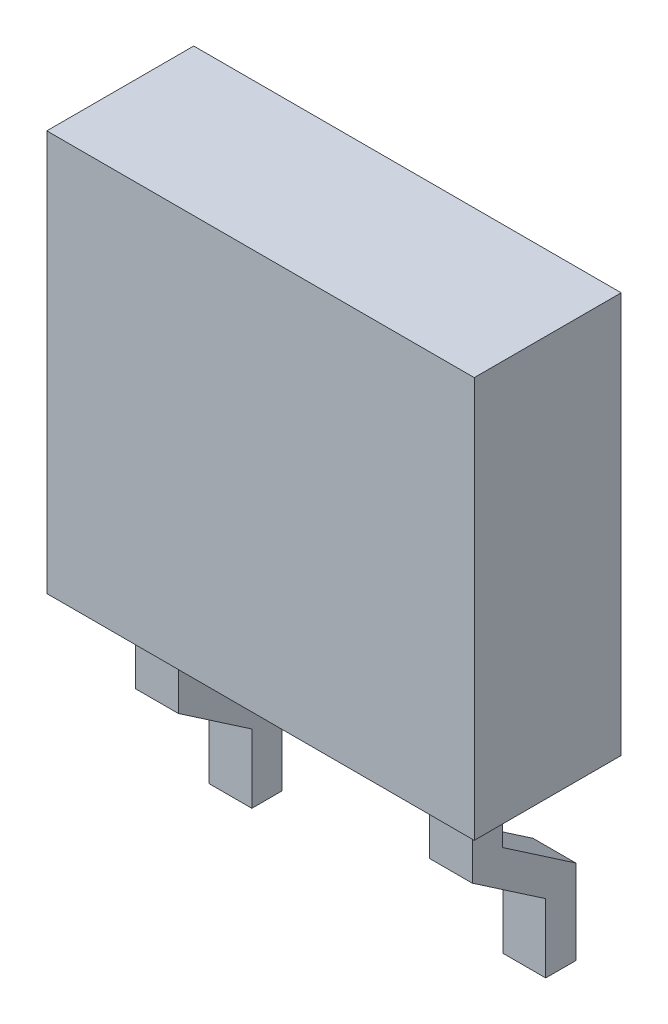
ISO-10303-21;
HEADER;
FILE_DESCRIPTION(('STEP AP214'),'2;1');
FILE_NAME('part.step','',(''),(''),'','','');
FILE_SCHEMA(('AUTOMOTIVE_DESIGN { 1 0 10303 214 1 1 1 1 }'));
ENDSEC;
DATA;
#1=APPLICATION_CONTEXT('core data for automotive mechanical design processes');
#2=APPLICATION_PROTOCOL_DEFINITION('international standard','automotive_design',2000,#1);
#3=PRODUCT_CONTEXT('',#1,'mechanical');
#4=PRODUCT('Part','Part','',(#3));
#5=PRODUCT_RELATED_PRODUCT_CATEGORY('part','',(#4));
#6=PRODUCT_DEFINITION_FORMATION('','',#4);
#7=PRODUCT_DEFINITION_CONTEXT('part definition',#1,'design');
#8=PRODUCT_DEFINITION('design','',#6,#7);
#9=PRODUCT_DEFINITION_SHAPE('','',#8);
#10=(LENGTH_UNIT() NAMED_UNIT(*) SI_UNIT(.MILLI.,.METRE.));
#11=(NAMED_UNIT(*) PLANE_ANGLE_UNIT() SI_UNIT($,.RADIAN.));
#12=(NAMED_UNIT(*) SI_UNIT($,.STERADIAN.) SOLID_ANGLE_UNIT());
#13=UNCERTAINTY_MEASURE_WITH_UNIT(LENGTH_MEASURE(1.E-05),#10,'distance_accuracy_value','');
#14=(GEOMETRIC_REPRESENTATION_CONTEXT(3) GLOBAL_UNCERTAINTY_ASSIGNED_CONTEXT((#13)) GLOBAL_UNIT_ASSIGNED_CONTEXT((#10,
#11,#12)) REPRESENTATION_CONTEXT('',''));
#15=CARTESIAN_POINT('',(0.,0.,0.));
#16=DIRECTION('',(0.,0.,1.));
#17=DIRECTION('',(1.,0.,0.));
#18=AXIS2_PLACEMENT_3D('',#15,#16,#17);
#19=CARTESIAN_POINT('',(0.,6.,0.));
#20=DIRECTION('',(0.,0.,-1.));
#21=DIRECTION('',(-1.,0.,0.));
#22=AXIS2_PLACEMENT_3D('',#19,#20,#21);
#23=PLANE('',#22);
#24=DIRECTION('',(-1.,0.,0.));
#25=VECTOR('',#24,1.);
#26=CARTESIAN_POINT('',(0.,-1.73351997941968,0.));
#27=LINE('',#26,#25);
#28=CARTESIAN_POINT('',(1.32,-1.73351997941969,0.));
#29=VERTEX_POINT('',#28);
#30=CARTESIAN_POINT('',(0.679999999999997,-1.73351997941969,0.));
#31=VERTEX_POINT('',#30);
#32=EDGE_CURVE('E38',#29,#31,#27,.T.);
#33=ORIENTED_EDGE('',*,*,#32,.F.);
#34=DIRECTION('',(0.,1.,0.));
#35=VECTOR('',#34,1.);
#36=CARTESIAN_POINT('',(1.32,0.,0.));
#37=LINE('',#36,#35);
#38=CARTESIAN_POINT('',(1.31999999999999,-2.99999999999999,0.));
#39=VERTEX_POINT('',#38);
#40=EDGE_CURVE('E230',#39,#29,#37,.T.);
#41=ORIENTED_EDGE('',*,*,#40,.F.);
#42=DIRECTION('',(1.,0.,0.));
#43=VECTOR('',#42,1.);
#44=CARTESIAN_POINT('',(1.31999999999999,-2.99999999999999,0.));
#45=LINE('',#44,#43);
#46=CARTESIAN_POINT('',(0.679999999999993,-3.,0.));
#47=VERTEX_POINT('',#46);
#48=EDGE_CURVE('E227',#47,#39,#45,.T.);
#49=ORIENTED_EDGE('',*,*,#48,.F.);
#50=DIRECTION('',(0.,-1.,0.));
#51=VECTOR('',#50,1.);
#52=CARTESIAN_POINT('',(0.679999999999997,0.,0.));
#53=LINE('',#52,#51);
#54=EDGE_CURVE('E223',#31,#47,#53,.T.);
#55=ORIENTED_EDGE('',*,*,#54,.F.);
#56=EDGE_LOOP('',(#33,#41,#49,#55));
#57=FACE_BOUND('',#56,.T.);
#58=ADVANCED_FACE('F34',(#57),#23,.T.);
#59=CARTESIAN_POINT('',(5.72,-1.73351997941969,0.));
#60=VERTEX_POINT('',#59);
#61=CARTESIAN_POINT('',(5.08,-1.73351997941968,0.));
#62=VERTEX_POINT('',#61);
#63=EDGE_CURVE('E11',#60,#62,#27,.T.);
#64=ORIENTED_EDGE('',*,*,#63,.F.);
#65=DIRECTION('',(0.,1.,0.));
#66=VECTOR('',#65,1.);
#67=CARTESIAN_POINT('',(5.72,0.,0.));
#68=LINE('',#67,#66);
#69=CARTESIAN_POINT('',(5.72,-3.,0.));
#70=VERTEX_POINT('',#69);
#71=EDGE_CURVE('E243',#70,#60,#68,.T.);
#72=ORIENTED_EDGE('',*,*,#71,.F.);
#73=DIRECTION('',(1.,0.,0.));
#74=VECTOR('',#73,1.);
#75=CARTESIAN_POINT('',(5.08,-3.,0.));
#76=LINE('',#75,#74);
#77=CARTESIAN_POINT('',(5.08,-3.,0.));
#78=VERTEX_POINT('',#77);
#79=EDGE_CURVE('E240',#78,#70,#76,.T.);
#80=ORIENTED_EDGE('',*,*,#79,.F.);
#81=DIRECTION('',(0.,-1.,0.));
#82=VECTOR('',#81,1.);
#83=CARTESIAN_POINT('',(5.08,0.,0.));
#84=LINE('',#83,#82);
#85=EDGE_CURVE('E238',#62,#78,#84,.T.);
#86=ORIENTED_EDGE('',*,*,#85,.F.);
#87=EDGE_LOOP('',(#64,#72,#80,#86));
#88=FACE_BOUND('',#87,.T.);
#89=ADVANCED_FACE('F342',(#88),#23,.T.);
#90=CARTESIAN_POINT('',(0.,0.,2.2));
#91=DIRECTION('',(1.,0.,0.));
#92=DIRECTION('',(0.,1.,0.));
#93=AXIS2_PLACEMENT_3D('',#90,#91,#92);
#94=PLANE('',#93);
#95=DIRECTION('',(0.,-1.,0.));
#96=VECTOR('',#95,1.);
#97=CARTESIAN_POINT('',(0.,0.,0.));
#98=LINE('',#97,#96);
#99=CARTESIAN_POINT('',(0.,6.,0.));
#100=VERTEX_POINT('',#99);
#101=CARTESIAN_POINT('',(0.,0.,0.));
#102=VERTEX_POINT('',#101);
#103=EDGE_CURVE('E228',#100,#102,#98,.T.);
#104=ORIENTED_EDGE('',*,*,#103,.T.);
#105=DIRECTION('',(0.,0.,-1.));
#106=VECTOR('',#105,1.);
#107=CARTESIAN_POINT('',(0.,0.,2.2));
#108=LINE('',#107,#106);
#109=CARTESIAN_POINT('',(0.,0.,2.2));
#110=VERTEX_POINT('',#109);
#111=EDGE_CURVE('E197',#110,#102,#108,.T.);
#112=ORIENTED_EDGE('',*,*,#111,.F.);
#113=DIRECTION('',(0.,-1.,0.));
#114=VECTOR('',#113,1.);
#115=CARTESIAN_POINT('',(0.,0.,2.2));
#116=LINE('',#115,#114);
#117=CARTESIAN_POINT('',(0.,6.00000000000001,2.2));
#118=VERTEX_POINT('',#117);
#119=EDGE_CURVE('E253',#118,#110,#116,.T.);
#120=ORIENTED_EDGE('',*,*,#119,.F.);
#121=DIRECTION('',(0.,0.,-1.));
#122=VECTOR('',#121,1.);
#123=CARTESIAN_POINT('',(0.,6.00000000000001,2.2));
#124=LINE('',#123,#122);
#125=EDGE_CURVE('E259',#118,#100,#124,.T.);
#126=ORIENTED_EDGE('',*,*,#125,.T.);
#127=EDGE_LOOP('',(#104,#112,#120,#126));
#128=FACE_BOUND('',#127,.T.);
#129=ADVANCED_FACE('F36',(#128),#94,.F.);
#130=CARTESIAN_POINT('',(0.679999999999997,0.,2.2));
#131=DIRECTION('',(1.,0.,0.));
#132=DIRECTION('',(0.,1.,0.));
#133=AXIS2_PLACEMENT_3D('',#130,#131,#132);
#134=PLANE('',#133);
#135=DIRECTION('',(0.,0.,-1.));
#136=VECTOR('',#135,1.);
#137=CARTESIAN_POINT('',(0.679999999999997,0.,2.2));
#138=LINE('',#137,#136);
#139=CARTESIAN_POINT('',(0.679999999999997,0.,1.55));
#140=VERTEX_POINT('',#139);
#141=CARTESIAN_POINT('',(0.680000000000003,0.,1.1));
#142=VERTEX_POINT('',#141);
#143=EDGE_CURVE('E175',#140,#142,#138,.T.);
#144=ORIENTED_EDGE('',*,*,#143,.T.);
#145=DIRECTION('',(0.,1.,0.));
#146=VECTOR('',#145,1.);
#147=CARTESIAN_POINT('',(0.680000000000003,0.,1.1));
#148=LINE('',#147,#146);
#149=CARTESIAN_POINT('',(0.679999999999993,-0.98267509698886,1.1));
#150=VERTEX_POINT('',#149);
#151=EDGE_CURVE('E184',#150,#142,#148,.T.);
#152=ORIENTED_EDGE('',*,*,#151,.F.);
#153=DIRECTION('',(0.,0.563769806185427,0.825931961867105));
#154=VECTOR('',#153,1.);
#155=CARTESIAN_POINT('',(0.679999999999993,-0.98267509698886,1.1));
#156=LINE('',#155,#154);
#157=EDGE_CURVE('E181',#31,#150,#156,.T.);
#158=ORIENTED_EDGE('',*,*,#157,.F.);
#159=ORIENTED_EDGE('',*,*,#54,.T.);
#160=DIRECTION('',(0.,0.,-1.));
#161=VECTOR('',#160,1.);
#162=CARTESIAN_POINT('',(0.679999999999993,-2.99999999999999,2.2));
#163=LINE('',#162,#161);
#164=CARTESIAN_POINT('',(0.679999999999993,-3.,0.450000000000006));
#165=VERTEX_POINT('',#164);
#166=EDGE_CURVE('E198',#165,#47,#163,.T.);
#167=ORIENTED_EDGE('',*,*,#166,.F.);
#168=DIRECTION('',(0.,-1.,0.));
#169=VECTOR('',#168,1.);
#170=CARTESIAN_POINT('',(0.679999999999993,-1.97119523147409,0.450000000000001));
#171=LINE('',#170,#169);
#172=CARTESIAN_POINT('',(0.679999999999993,-1.97119523147409,0.450000000000001));
#173=VERTEX_POINT('',#172);
#174=EDGE_CURVE('E288',#173,#165,#171,.T.);
#175=ORIENTED_EDGE('',*,*,#174,.F.);
#176=DIRECTION('',(0.,-0.563769806185427,-0.825931961867105));
#177=VECTOR('',#176,1.);
#178=CARTESIAN_POINT('',(0.680000000000007,-1.22035034904328,1.55));
#179=LINE('',#178,#177);
#180=CARTESIAN_POINT('',(0.680000000000007,-1.22035034904328,1.55));
#181=VERTEX_POINT('',#180);
#182=EDGE_CURVE('E290',#181,#173,#179,.T.);
#183=ORIENTED_EDGE('',*,*,#182,.F.);
#184=DIRECTION('',(0.,-1.,0.));
#185=VECTOR('',#184,1.);
#186=CARTESIAN_POINT('',(0.679999999999997,0.,1.55));
#187=LINE('',#186,#185);
#188=EDGE_CURVE('E196',#140,#181,#187,.T.);
#189=ORIENTED_EDGE('',*,*,#188,.F.);
#190=EDGE_LOOP('',(#144,#152,#158,#159,#167,#175,#183,#189));
#191=FACE_BOUND('',#190,.T.);
#192=ADVANCED_FACE('F193',(#191),#134,.F.);
#193=CARTESIAN_POINT('',(1.31999999999999,-2.99999999999999,2.2));
#194=DIRECTION('',(0.,1.,0.));
#195=DIRECTION('',(0.,0.,1.));
#196=AXIS2_PLACEMENT_3D('',#193,#194,#195);
#197=PLANE('',#196);
#198=DIRECTION('',(0.,0.,-1.));
#199=VECTOR('',#198,1.);
#200=CARTESIAN_POINT('',(1.31999999999999,-2.99999999999999,2.2));
#201=LINE('',#200,#199);
#202=CARTESIAN_POINT('',(1.32,-3.,0.450000000000001));
#203=VERTEX_POINT('',#202);
#204=EDGE_CURVE('E204',#203,#39,#201,.T.);
#205=ORIENTED_EDGE('',*,*,#204,.F.);
#206=DIRECTION('',(-1.,0.,0.));
#207=VECTOR('',#206,1.);
#208=CARTESIAN_POINT('',(1.32,-3.,0.450000000000001));
#209=LINE('',#208,#207);
#210=EDGE_CURVE('E233',#203,#165,#209,.T.);
#211=ORIENTED_EDGE('',*,*,#210,.T.);
#212=ORIENTED_EDGE('',*,*,#166,.T.);
#213=ORIENTED_EDGE('',*,*,#48,.T.);
#214=EDGE_LOOP('',(#205,#211,#212,#213));
#215=FACE_BOUND('',#214,.T.);
#216=ADVANCED_FACE('F286',(#215),#197,.F.);
#217=CARTESIAN_POINT('',(1.32000000000001,0.,2.2));
#218=DIRECTION('',(-1.,0.,0.));
#219=DIRECTION('',(0.,-1.,0.));
#220=AXIS2_PLACEMENT_3D('',#217,#218,#219);
#221=PLANE('',#220);
#222=DIRECTION('',(0.,0.563769806185427,0.825931961867105));
#223=VECTOR('',#222,1.);
#224=CARTESIAN_POINT('',(1.31999999999999,-0.158146135057723,2.30794837834937));
#225=LINE('',#224,#223);
#226=CARTESIAN_POINT('',(1.31999999999999,-0.982675096988857,1.09999999999999));
#227=VERTEX_POINT('',#226);
#228=EDGE_CURVE('E217',#29,#227,#225,.T.);
#229=ORIENTED_EDGE('',*,*,#228,.T.);
#230=DIRECTION('',(0.,1.,0.));
#231=VECTOR('',#230,1.);
#232=CARTESIAN_POINT('',(1.31999999999999,0.,1.1));
#233=LINE('',#232,#231);
#234=CARTESIAN_POINT('',(1.31999999999999,0.,1.1));
#235=VERTEX_POINT('',#234);
#236=EDGE_CURVE('E360',#227,#235,#233,.T.);
#237=ORIENTED_EDGE('',*,*,#236,.T.);
#238=DIRECTION('',(0.,0.,-1.));
#239=VECTOR('',#238,1.);
#240=CARTESIAN_POINT('',(1.32000000000001,0.,2.2));
#241=LINE('',#240,#239);
#242=CARTESIAN_POINT('',(1.32000000000001,0.,1.55));
#243=VERTEX_POINT('',#242);
#244=EDGE_CURVE('E177',#243,#235,#241,.T.);
#245=ORIENTED_EDGE('',*,*,#244,.F.);
#246=DIRECTION('',(0.,-1.,0.));
#247=VECTOR('',#246,1.);
#248=CARTESIAN_POINT('',(1.32000000000001,0.,1.55));
#249=LINE('',#248,#247);
#250=CARTESIAN_POINT('',(1.32,-1.22035034904327,1.55));
#251=VERTEX_POINT('',#250);
#252=EDGE_CURVE('E311',#243,#251,#249,.T.);
#253=ORIENTED_EDGE('',*,*,#252,.T.);
#254=DIRECTION('',(0.,-0.563769806185427,-0.825931961867105));
#255=VECTOR('',#254,1.);
#256=CARTESIAN_POINT('',(1.32,-0.529815517897929,2.56164479113281));
#257=LINE('',#256,#255);
#258=CARTESIAN_POINT('',(1.32,-1.9711952314741,0.449999999999999));
#259=VERTEX_POINT('',#258);
#260=EDGE_CURVE('E317',#251,#259,#257,.T.);
#261=ORIENTED_EDGE('',*,*,#260,.T.);
#262=DIRECTION('',(0.,-1.,0.));
#263=VECTOR('',#262,1.);
#264=CARTESIAN_POINT('',(1.32000000000001,0.,0.449999999999997));
#265=LINE('',#264,#263);
#266=EDGE_CURVE('E283',#259,#203,#265,.T.);
#267=ORIENTED_EDGE('',*,*,#266,.T.);
#268=ORIENTED_EDGE('',*,*,#204,.T.);
#269=ORIENTED_EDGE('',*,*,#40,.T.);
#270=EDGE_LOOP('',(#229,#237,#245,#253,#261,#267,#268,#269));
#271=FACE_BOUND('',#270,.T.);
#272=ADVANCED_FACE('F281',(#271),#221,.F.);
#273=CARTESIAN_POINT('',(5.08,0.,2.19999999999999));
#274=DIRECTION('',(1.,0.,0.));
#275=DIRECTION('',(0.,1.,0.));
#276=AXIS2_PLACEMENT_3D('',#273,#274,#275);
#277=PLANE('',#276);
#278=DIRECTION('',(0.,0.,-1.));
#279=VECTOR('',#278,1.);
#280=CARTESIAN_POINT('',(5.08,0.,2.19999999999999));
#281=LINE('',#280,#279);
#282=CARTESIAN_POINT('',(5.08,0.,1.55));
#283=VERTEX_POINT('',#282);
#284=CARTESIAN_POINT('',(5.08,0.,1.1));
#285=VERTEX_POINT('',#284);
#286=EDGE_CURVE('E275',#283,#285,#281,.T.);
#287=ORIENTED_EDGE('',*,*,#286,.T.);
#288=DIRECTION('',(0.,-1.,0.));
#289=VECTOR('',#288,1.);
#290=CARTESIAN_POINT('',(5.08,0.,1.1));
#291=LINE('',#290,#289);
#292=CARTESIAN_POINT('',(5.08,-0.982675096988853,1.1));
#293=VERTEX_POINT('',#292);
#294=EDGE_CURVE('E351',#285,#293,#291,.T.);
#295=ORIENTED_EDGE('',*,*,#294,.T.);
#296=DIRECTION('',(0.,-0.563769806185427,-0.825931961867105));
#297=VECTOR('',#296,1.);
#298=CARTESIAN_POINT('',(5.08,-0.158146135057723,2.30794837834938));
#299=LINE('',#298,#297);
#300=EDGE_CURVE('E348',#293,#62,#299,.T.);
#301=ORIENTED_EDGE('',*,*,#300,.T.);
#302=ORIENTED_EDGE('',*,*,#85,.T.);
#303=DIRECTION('',(0.,0.,-1.));
#304=VECTOR('',#303,1.);
#305=CARTESIAN_POINT('',(5.08,-3.,2.2));
#306=LINE('',#305,#304);
#307=CARTESIAN_POINT('',(5.08,-3.,0.449999999999999));
#308=VERTEX_POINT('',#307);
#309=EDGE_CURVE('E272',#308,#78,#306,.T.);
#310=ORIENTED_EDGE('',*,*,#309,.F.);
#311=DIRECTION('',(0.,1.,0.));
#312=VECTOR('',#311,1.);
#313=CARTESIAN_POINT('',(5.08,0.,0.449999999999997));
#314=LINE('',#313,#312);
#315=CARTESIAN_POINT('',(5.07999999999999,-1.9711952314741,0.449999999999996));
#316=VERTEX_POINT('',#315);
#317=EDGE_CURVE('E322',#308,#316,#314,.T.);
#318=ORIENTED_EDGE('',*,*,#317,.T.);
#319=DIRECTION('',(0.,0.563769806185427,0.825931961867105));
#320=VECTOR('',#319,1.);
#321=CARTESIAN_POINT('',(5.08,-0.529815517897929,2.56164479113281));
#322=LINE('',#321,#320);
#323=CARTESIAN_POINT('',(5.08,-1.22035034904327,1.55));
#324=VERTEX_POINT('',#323);
#325=EDGE_CURVE('E314',#316,#324,#322,.T.);
#326=ORIENTED_EDGE('',*,*,#325,.T.);
#327=DIRECTION('',(0.,1.,0.));
#328=VECTOR('',#327,1.);
#329=CARTESIAN_POINT('',(5.08,0.,1.54999999999999));
#330=LINE('',#329,#328);
#331=EDGE_CURVE('E308',#324,#283,#330,.T.);
#332=ORIENTED_EDGE('',*,*,#331,.T.);
#333=EDGE_LOOP('',(#287,#295,#301,#302,#310,#318,#326,#332));
#334=FACE_BOUND('',#333,.T.);
#335=ADVANCED_FACE('F327',(#334),#277,.F.);
#336=CARTESIAN_POINT('',(5.08,-3.,2.2));
#337=DIRECTION('',(0.,1.,0.));
#338=DIRECTION('',(0.,0.,1.));
#339=AXIS2_PLACEMENT_3D('',#336,#337,#338);
#340=PLANE('',#339);
#341=DIRECTION('',(0.,0.,-1.));
#342=VECTOR('',#341,1.);
#343=CARTESIAN_POINT('',(5.72,-3.,2.2));
#344=LINE('',#343,#342);
#345=CARTESIAN_POINT('',(5.72,-3.,0.450000000000001));
#346=VERTEX_POINT('',#345);
#347=EDGE_CURVE('E270',#346,#70,#344,.T.);
#348=ORIENTED_EDGE('',*,*,#347,.F.);
#349=DIRECTION('',(-1.,0.,0.));
#350=VECTOR('',#349,1.);
#351=CARTESIAN_POINT('',(5.08,-3.,0.449999999999999));
#352=LINE('',#351,#350);
#353=EDGE_CURVE('E319',#346,#308,#352,.T.);
#354=ORIENTED_EDGE('',*,*,#353,.T.);
#355=ORIENTED_EDGE('',*,*,#309,.T.);
#356=ORIENTED_EDGE('',*,*,#79,.T.);
#357=EDGE_LOOP('',(#348,#354,#355,#356));
#358=FACE_BOUND('',#357,.T.);
#359=ADVANCED_FACE('F333',(#358),#340,.F.);
#360=CARTESIAN_POINT('',(5.72,0.,2.2));
#361=DIRECTION('',(-1.,0.,0.));
#362=DIRECTION('',(0.,-1.,0.));
#363=AXIS2_PLACEMENT_3D('',#360,#361,#362);
#364=PLANE('',#363);
#365=DIRECTION('',(0.,0.563769806185427,0.825931961867105));
#366=VECTOR('',#365,1.);
#367=CARTESIAN_POINT('',(5.72,-0.158146135057723,2.30794837834937));
#368=LINE('',#367,#366);
#369=CARTESIAN_POINT('',(5.72,-0.98267509698886,1.1));
#370=VERTEX_POINT('',#369);
#371=EDGE_CURVE('E339',#60,#370,#368,.T.);
#372=ORIENTED_EDGE('',*,*,#371,.T.);
#373=DIRECTION('',(0.,1.,0.));
#374=VECTOR('',#373,1.);
#375=CARTESIAN_POINT('',(5.72,0.,1.1));
#376=LINE('',#375,#374);
#377=CARTESIAN_POINT('',(5.72,0.,1.1));
#378=VERTEX_POINT('',#377);
#379=EDGE_CURVE('E353',#370,#378,#376,.T.);
#380=ORIENTED_EDGE('',*,*,#379,.T.);
#381=DIRECTION('',(0.,0.,-1.));
#382=VECTOR('',#381,1.);
#383=CARTESIAN_POINT('',(5.72,0.,2.2));
#384=LINE('',#383,#382);
#385=CARTESIAN_POINT('',(5.72000000000001,0.,1.55));
#386=VERTEX_POINT('',#385);
#387=EDGE_CURVE('E267',#386,#378,#384,.T.);
#388=ORIENTED_EDGE('',*,*,#387,.F.);
#389=DIRECTION('',(0.,-1.,0.));
#390=VECTOR('',#389,1.);
#391=CARTESIAN_POINT('',(5.72000000000001,0.,1.54999999999999));
#392=LINE('',#391,#390);
#393=CARTESIAN_POINT('',(5.72,-1.22035034904327,1.55));
#394=VERTEX_POINT('',#393);
#395=EDGE_CURVE('E305',#386,#394,#392,.T.);
#396=ORIENTED_EDGE('',*,*,#395,.T.);
#397=DIRECTION('',(0.,-0.563769806185427,-0.825931961867105));
#398=VECTOR('',#397,1.);
#399=CARTESIAN_POINT('',(5.72000000000001,-0.529815517897929,2.56164479113282));
#400=LINE('',#399,#398);
#401=CARTESIAN_POINT('',(5.72,-1.97119523147411,0.450000000000001));
#402=VERTEX_POINT('',#401);
#403=EDGE_CURVE('E201',#394,#402,#400,.T.);
#404=ORIENTED_EDGE('',*,*,#403,.T.);
#405=DIRECTION('',(0.,-1.,0.));
#406=VECTOR('',#405,1.);
#407=CARTESIAN_POINT('',(5.72,0.,0.449999999999999));
#408=LINE('',#407,#406);
#409=EDGE_CURVE('E209',#402,#346,#408,.T.);
#410=ORIENTED_EDGE('',*,*,#409,.T.);
#411=ORIENTED_EDGE('',*,*,#347,.T.);
#412=ORIENTED_EDGE('',*,*,#71,.T.);
#413=EDGE_LOOP('',(#372,#380,#388,#396,#404,#410,#411,#412));
#414=FACE_BOUND('',#413,.T.);
#415=ADVANCED_FACE('F337',(#414),#364,.F.);
#416=CARTESIAN_POINT('',(5.72,0.,2.2));
#417=DIRECTION('',(0.,1.,0.));
#418=DIRECTION('',(0.,0.,1.));
#419=AXIS2_PLACEMENT_3D('',#416,#417,#418);
#420=PLANE('',#419);
#421=ORIENTED_EDGE('',*,*,#111,.T.);
#422=DIRECTION('',(1.,0.,0.));
#423=VECTOR('',#422,1.);
#424=CARTESIAN_POINT('',(5.72,0.,0.));
#425=LINE('',#424,#423);
#426=CARTESIAN_POINT('',(6.4,0.,0.));
#427=VERTEX_POINT('',#426);
#428=EDGE_CURVE('E246',#102,#427,#425,.T.);
#429=ORIENTED_EDGE('',*,*,#428,.T.);
#430=DIRECTION('',(0.,0.,-1.));
#431=VECTOR('',#430,1.);
#432=CARTESIAN_POINT('',(6.4,0.,2.2));
#433=LINE('',#432,#431);
#434=CARTESIAN_POINT('',(6.4,0.,2.2));
#435=VERTEX_POINT('',#434);
#436=EDGE_CURVE('E265',#435,#427,#433,.T.);
#437=ORIENTED_EDGE('',*,*,#436,.F.);
#438=DIRECTION('',(1.,0.,0.));
#439=VECTOR('',#438,1.);
#440=CARTESIAN_POINT('',(0.,0.,2.2));
#441=LINE('',#440,#439);
#442=EDGE_CURVE('E255',#110,#435,#441,.T.);
#443=ORIENTED_EDGE('',*,*,#442,.F.);
#444=EDGE_LOOP('',(#421,#429,#437,#443));
#445=FACE_BOUND('',#444,.T.);
#446=DIRECTION('',(-1.,0.,0.));
#447=VECTOR('',#446,1.);
#448=CARTESIAN_POINT('',(6.4,0.,1.09999999999999));
#449=LINE('',#448,#447);
#450=EDGE_CURVE('E180',#378,#285,#449,.T.);
#451=ORIENTED_EDGE('',*,*,#450,.T.);
#452=ORIENTED_EDGE('',*,*,#286,.F.);
#453=DIRECTION('',(-1.,0.,0.));
#454=VECTOR('',#453,1.);
#455=CARTESIAN_POINT('',(6.4,0.,1.55));
#456=LINE('',#455,#454);
#457=EDGE_CURVE('E301',#386,#283,#456,.T.);
#458=ORIENTED_EDGE('',*,*,#457,.F.);
#459=ORIENTED_EDGE('',*,*,#387,.T.);
#460=EDGE_LOOP('',(#451,#452,#458,#459));
#461=FACE_BOUND('',#460,.T.);
#462=ORIENTED_EDGE('',*,*,#244,.T.);
#463=EDGE_CURVE('E170',#235,#142,#449,.T.);
#464=ORIENTED_EDGE('',*,*,#463,.T.);
#465=ORIENTED_EDGE('',*,*,#143,.F.);
#466=EDGE_CURVE('E299',#243,#140,#456,.T.);
#467=ORIENTED_EDGE('',*,*,#466,.F.);
#468=EDGE_LOOP('',(#462,#464,#465,#467));
#469=FACE_BOUND('',#468,.T.);
#470=ADVANCED_FACE('F172',(#445,#461,#469),#420,.F.);
#471=CARTESIAN_POINT('',(6.4,0.,2.2));
#472=DIRECTION('',(-1.,0.,0.));
#473=DIRECTION('',(0.,-1.,0.));
#474=AXIS2_PLACEMENT_3D('',#471,#472,#473);
#475=PLANE('',#474);
#476=DIRECTION('',(0.,1.,0.));
#477=VECTOR('',#476,1.);
#478=CARTESIAN_POINT('',(6.4,0.,0.));
#479=LINE('',#478,#477);
#480=CARTESIAN_POINT('',(6.4,6.00000000000001,0.));
#481=VERTEX_POINT('',#480);
#482=EDGE_CURVE('E249',#427,#481,#479,.T.);
#483=ORIENTED_EDGE('',*,*,#482,.T.);
#484=DIRECTION('',(0.,0.,-1.));
#485=VECTOR('',#484,1.);
#486=CARTESIAN_POINT('',(6.4,6.,2.2));
#487=LINE('',#486,#485);
#488=CARTESIAN_POINT('',(6.4,6.,2.2));
#489=VERTEX_POINT('',#488);
#490=EDGE_CURVE('E262',#489,#481,#487,.T.);
#491=ORIENTED_EDGE('',*,*,#490,.F.);
#492=DIRECTION('',(0.,1.,0.));
#493=VECTOR('',#492,1.);
#494=CARTESIAN_POINT('',(6.4,0.,2.2));
#495=LINE('',#494,#493);
#496=EDGE_CURVE('E54',#435,#489,#495,.T.);
#497=ORIENTED_EDGE('',*,*,#496,.F.);
#498=ORIENTED_EDGE('',*,*,#436,.T.);
#499=EDGE_LOOP('',(#483,#491,#497,#498));
#500=FACE_BOUND('',#499,.T.);
#501=ADVANCED_FACE('F414',(#500),#475,.F.);
#502=CARTESIAN_POINT('',(0.,6.00000000000001,2.2));
#503=DIRECTION('',(0.,-1.,0.));
#504=DIRECTION('',(0.,0.,-1.));
#505=AXIS2_PLACEMENT_3D('',#502,#503,#504);
#506=PLANE('',#505);
#507=DIRECTION('',(-1.,0.,0.));
#508=VECTOR('',#507,1.);
#509=CARTESIAN_POINT('',(0.,6.,0.));
#510=LINE('',#509,#508);
#511=EDGE_CURVE('E251',#481,#100,#510,.T.);
#512=ORIENTED_EDGE('',*,*,#511,.T.);
#513=ORIENTED_EDGE('',*,*,#125,.F.);
#514=DIRECTION('',(-1.,0.,0.));
#515=VECTOR('',#514,1.);
#516=CARTESIAN_POINT('',(0.,6.00000000000001,2.2));
#517=LINE('',#516,#515);
#518=EDGE_CURVE('E49',#489,#118,#517,.T.);
#519=ORIENTED_EDGE('',*,*,#518,.F.);
#520=ORIENTED_EDGE('',*,*,#490,.T.);
#521=EDGE_LOOP('',(#512,#513,#519,#520));
#522=FACE_BOUND('',#521,.T.);
#523=ADVANCED_FACE('F403',(#522),#506,.F.);
#524=CARTESIAN_POINT('',(0.,6.00000000000001,2.2));
#525=DIRECTION('',(0.,0.,-1.));
#526=DIRECTION('',(-1.,0.,0.));
#527=AXIS2_PLACEMENT_3D('',#524,#525,#526);
#528=PLANE('',#527);
#529=ORIENTED_EDGE('',*,*,#442,.T.);
#530=ORIENTED_EDGE('',*,*,#496,.T.);
#531=ORIENTED_EDGE('',*,*,#518,.T.);
#532=ORIENTED_EDGE('',*,*,#119,.T.);
#533=EDGE_LOOP('',(#529,#530,#531,#532));
#534=FACE_BOUND('',#533,.T.);
#535=ADVANCED_FACE('F395',(#534),#528,.F.);
#536=ORIENTED_EDGE('',*,*,#428,.F.);
#537=ORIENTED_EDGE('',*,*,#103,.F.);
#538=ORIENTED_EDGE('',*,*,#511,.F.);
#539=ORIENTED_EDGE('',*,*,#482,.F.);
#540=EDGE_LOOP('',(#536,#537,#538,#539));
#541=FACE_BOUND('',#540,.T.);
#542=ADVANCED_FACE('F388',(#541),#23,.T.);
#543=CARTESIAN_POINT('',(6.4,-1.22035034904327,1.55));
#544=DIRECTION('',(0.,0.825931961867105,-0.563769806185427));
#545=DIRECTION('',(0.,0.563769806185427,0.825931961867105));
#546=AXIS2_PLACEMENT_3D('',#543,#544,#545);
#547=PLANE('',#546);
#548=DIRECTION('',(-1.,0.,0.));
#549=VECTOR('',#548,1.);
#550=CARTESIAN_POINT('',(6.4,-1.9711952314741,0.450000000000001));
#551=LINE('',#550,#549);
#552=EDGE_CURVE('E302',#402,#316,#551,.T.);
#553=ORIENTED_EDGE('',*,*,#552,.F.);
#554=ORIENTED_EDGE('',*,*,#403,.F.);
#555=DIRECTION('',(-1.,0.,0.));
#556=VECTOR('',#555,1.);
#557=CARTESIAN_POINT('',(6.4,-1.22035034904327,1.55));
#558=LINE('',#557,#556);
#559=EDGE_CURVE('E294',#394,#324,#558,.T.);
#560=ORIENTED_EDGE('',*,*,#559,.T.);
#561=ORIENTED_EDGE('',*,*,#325,.F.);
#562=EDGE_LOOP('',(#553,#554,#560,#561));
#563=FACE_BOUND('',#562,.T.);
#564=ADVANCED_FACE('F376',(#563),#547,.F.);
#565=CARTESIAN_POINT('',(6.4,-1.9711952314741,0.450000000000001));
#566=DIRECTION('',(0.,0.,-1.));
#567=DIRECTION('',(-1.,0.,0.));
#568=AXIS2_PLACEMENT_3D('',#565,#566,#567);
#569=PLANE('',#568);
#570=ORIENTED_EDGE('',*,*,#353,.F.);
#571=ORIENTED_EDGE('',*,*,#409,.F.);
#572=ORIENTED_EDGE('',*,*,#552,.T.);
#573=ORIENTED_EDGE('',*,*,#317,.F.);
#574=EDGE_LOOP('',(#570,#571,#572,#573));
#575=FACE_BOUND('',#574,.T.);
#576=ADVANCED_FACE('F330',(#575),#569,.F.);
#577=CARTESIAN_POINT('',(6.4,0.,1.55));
#578=DIRECTION('',(0.,0.,-1.));
#579=DIRECTION('',(-1.,0.,0.));
#580=AXIS2_PLACEMENT_3D('',#577,#578,#579);
#581=PLANE('',#580);
#582=ORIENTED_EDGE('',*,*,#559,.F.);
#583=ORIENTED_EDGE('',*,*,#395,.F.);
#584=ORIENTED_EDGE('',*,*,#457,.T.);
#585=ORIENTED_EDGE('',*,*,#331,.F.);
#586=EDGE_LOOP('',(#582,#583,#584,#585));
#587=FACE_BOUND('',#586,.T.);
#588=ADVANCED_FACE('F374',(#587),#581,.F.);
#589=ORIENTED_EDGE('',*,*,#266,.F.);
#590=EDGE_CURVE('E303',#259,#173,#551,.T.);
#591=ORIENTED_EDGE('',*,*,#590,.T.);
#592=ORIENTED_EDGE('',*,*,#174,.T.);
#593=ORIENTED_EDGE('',*,*,#210,.F.);
#594=EDGE_LOOP('',(#589,#591,#592,#593));
#595=FACE_BOUND('',#594,.T.);
#596=ADVANCED_FACE('F475',(#595),#569,.F.);
#597=EDGE_CURVE('E292',#251,#181,#558,.T.);
#598=ORIENTED_EDGE('',*,*,#597,.T.);
#599=ORIENTED_EDGE('',*,*,#182,.T.);
#600=ORIENTED_EDGE('',*,*,#590,.F.);
#601=ORIENTED_EDGE('',*,*,#260,.F.);
#602=EDGE_LOOP('',(#598,#599,#600,#601));
#603=FACE_BOUND('',#602,.T.);
#604=ADVANCED_FACE('F402',(#603),#547,.F.);
#605=ORIENTED_EDGE('',*,*,#466,.T.);
#606=ORIENTED_EDGE('',*,*,#188,.T.);
#607=ORIENTED_EDGE('',*,*,#597,.F.);
#608=ORIENTED_EDGE('',*,*,#252,.F.);
#609=EDGE_LOOP('',(#605,#606,#607,#608));
#610=FACE_BOUND('',#609,.T.);
#611=ADVANCED_FACE('F363',(#610),#581,.F.);
#612=CARTESIAN_POINT('',(6.4,-0.982675096988857,1.10000000000001));
#613=DIRECTION('',(0.,-0.825931961867105,0.563769806185427));
#614=DIRECTION('',(0.,-0.563769806185427,-0.825931961867105));
#615=AXIS2_PLACEMENT_3D('',#612,#613,#614);
#616=PLANE('',#615);
#617=DIRECTION('',(-1.,0.,0.));
#618=VECTOR('',#617,1.);
#619=CARTESIAN_POINT('',(6.4,-0.982675096988857,1.10000000000001));
#620=LINE('',#619,#618);
#621=EDGE_CURVE('E355',#370,#293,#620,.T.);
#622=ORIENTED_EDGE('',*,*,#621,.F.);
#623=ORIENTED_EDGE('',*,*,#371,.F.);
#624=ORIENTED_EDGE('',*,*,#63,.T.);
#625=ORIENTED_EDGE('',*,*,#300,.F.);
#626=EDGE_LOOP('',(#622,#623,#624,#625));
#627=FACE_BOUND('',#626,.T.);
#628=ADVANCED_FACE('F347',(#627),#616,.F.);
#629=CARTESIAN_POINT('',(6.4,0.,1.09999999999999));
#630=DIRECTION('',(0.,0.,1.));
#631=DIRECTION('',(1.,0.,0.));
#632=AXIS2_PLACEMENT_3D('',#629,#630,#631);
#633=PLANE('',#632);
#634=ORIENTED_EDGE('',*,*,#450,.F.);
#635=ORIENTED_EDGE('',*,*,#379,.F.);
#636=ORIENTED_EDGE('',*,*,#621,.T.);
#637=ORIENTED_EDGE('',*,*,#294,.F.);
#638=EDGE_LOOP('',(#634,#635,#636,#637));
#639=FACE_BOUND('',#638,.T.);
#640=ADVANCED_FACE('F377',(#639),#633,.F.);
#641=EDGE_CURVE('E187',#227,#150,#620,.T.);
#642=ORIENTED_EDGE('',*,*,#641,.T.);
#643=ORIENTED_EDGE('',*,*,#151,.T.);
#644=ORIENTED_EDGE('',*,*,#463,.F.);
#645=ORIENTED_EDGE('',*,*,#236,.F.);
#646=EDGE_LOOP('',(#642,#643,#644,#645));
#647=FACE_BOUND('',#646,.T.);
#648=ADVANCED_FACE('F185',(#647),#633,.F.);
#649=ORIENTED_EDGE('',*,*,#32,.T.);
#650=ORIENTED_EDGE('',*,*,#157,.T.);
#651=ORIENTED_EDGE('',*,*,#641,.F.);
#652=ORIENTED_EDGE('',*,*,#228,.F.);
#653=EDGE_LOOP('',(#649,#650,#651,#652));
#654=FACE_BOUND('',#653,.T.);
#655=ADVANCED_FACE('F215',(#654),#616,.F.);
#656=CLOSED_SHELL('',(#58,#89,#129,#192,#216,#272,#335,#359,#415,#470,#501,#523,#535,#542,#564,
#576,#588,#596,#604,#611,#628,#640,#648,#655));
#657=MANIFOLD_SOLID_BREP('B2',#656);
#658=ADVANCED_BREP_SHAPE_REPRESENTATION('',(#18,#657),#14);
#659=SHAPE_DEFINITION_REPRESENTATION(#9,#658);
ENDSEC;
END-ISO-10303-21;
